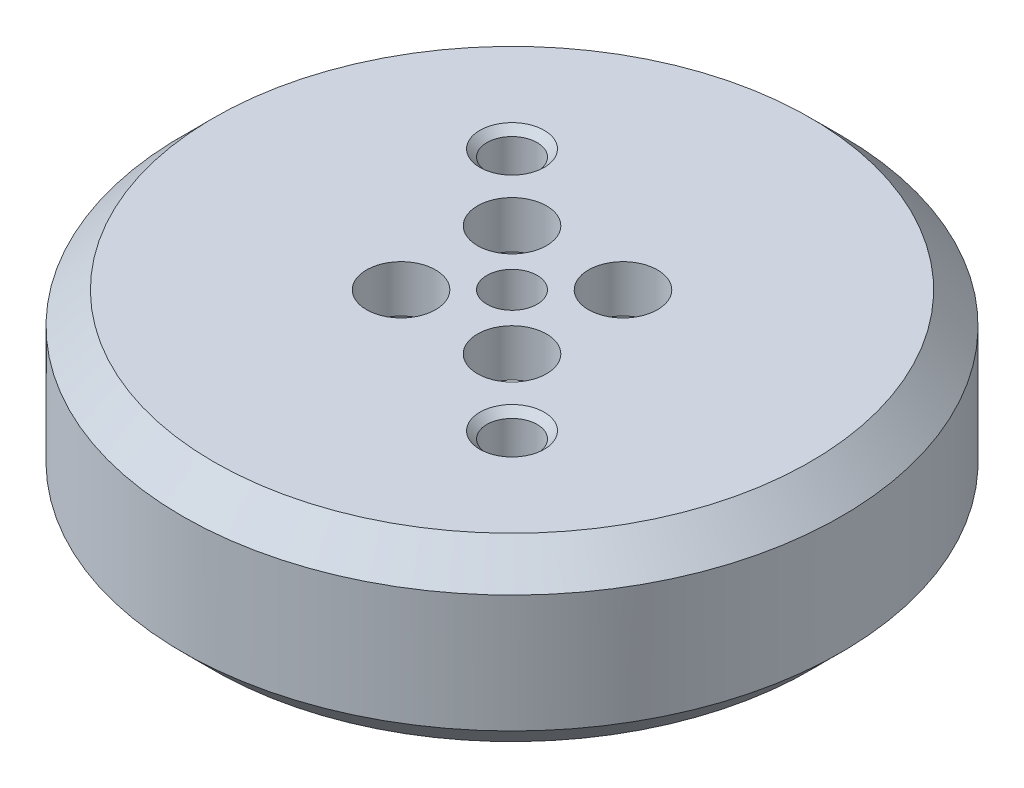
ISO-10303-21;
HEADER;
FILE_DESCRIPTION(('STEP AP214'),'2;1');
FILE_NAME('part.step','',(''),(''),'','','');
FILE_SCHEMA(('AUTOMOTIVE_DESIGN { 1 0 10303 214 1 1 1 1 }'));
ENDSEC;
DATA;
#1=APPLICATION_CONTEXT('core data for automotive mechanical design processes');
#2=APPLICATION_PROTOCOL_DEFINITION('international standard','automotive_design',2000,#1);
#3=PRODUCT_CONTEXT('',#1,'mechanical');
#4=PRODUCT('Part','Part','',(#3));
#5=PRODUCT_RELATED_PRODUCT_CATEGORY('part','',(#4));
#6=PRODUCT_DEFINITION_FORMATION('','',#4);
#7=PRODUCT_DEFINITION_CONTEXT('part definition',#1,'design');
#8=PRODUCT_DEFINITION('design','',#6,#7);
#9=PRODUCT_DEFINITION_SHAPE('','',#8);
#10=(LENGTH_UNIT() NAMED_UNIT(*) SI_UNIT(.MILLI.,.METRE.));
#11=(NAMED_UNIT(*) PLANE_ANGLE_UNIT() SI_UNIT($,.RADIAN.));
#12=(NAMED_UNIT(*) SI_UNIT($,.STERADIAN.) SOLID_ANGLE_UNIT());
#13=UNCERTAINTY_MEASURE_WITH_UNIT(LENGTH_MEASURE(1.E-05),#10,'distance_accuracy_value','');
#14=(GEOMETRIC_REPRESENTATION_CONTEXT(3) GLOBAL_UNCERTAINTY_ASSIGNED_CONTEXT((#13)) GLOBAL_UNIT_ASSIGNED_CONTEXT((#10,
#11,#12)) REPRESENTATION_CONTEXT('',''));
#15=CARTESIAN_POINT('',(0.,0.,0.));
#16=DIRECTION('',(0.,0.,1.));
#17=DIRECTION('',(1.,0.,0.));
#18=AXIS2_PLACEMENT_3D('',#15,#16,#17);
#19=CARTESIAN_POINT('',(0.,-1.,0.));
#20=DIRECTION('',(0.,1.,0.));
#21=DIRECTION('',(0.,0.,1.));
#22=AXIS2_PLACEMENT_3D('',#19,#20,#21);
#23=TOROIDAL_SURFACE('',#22,4.7357470513792,1.);
#24=CARTESIAN_POINT('',(0.,-0.130543442607231,0.));
#25=DIRECTION('',(0.,1.,0.));
#26=DIRECTION('',(0.,0.,1.));
#27=AXIS2_PLACEMENT_3D('',#24,#25,#26);
#28=CIRCLE('',#27,5.22975645898873);
#29=CARTESIAN_POINT('',(-4.17945635745006,-0.130543442607231,-3.14364393284364));
#30=VERTEX_POINT('',#29);
#31=CARTESIAN_POINT('',(3.14364393284364,-0.130543442607231,4.17945635745005));
#32=VERTEX_POINT('',#31);
#33=EDGE_CURVE('E64',#30,#32,#28,.T.);
#34=ORIENTED_EDGE('',*,*,#33,.F.);
#35=CARTESIAN_POINT('',(-4.4822891057726,-0.492217787000647,-3.35232700225438));
#36=CARTESIAN_POINT('',(-4.4732032933485,-0.469683389474045,-3.34229177425603));
#37=CARTESIAN_POINT('',(-4.4633088491144,-0.447666005418995,-3.33186407787081));
#38=CARTESIAN_POINT('',(-4.44175096029905,-0.404737713196822,-3.31047174151622));
#39=CARTESIAN_POINT('',(-4.43008472820176,-0.383828619866387,-3.2995062742211));
#40=CARTESIAN_POINT('',(-4.39219435143152,-0.32289360954591,-3.26618056046404));
#41=CARTESIAN_POINT('',(-4.36311533631435,-0.284755035080705,-3.24343514928884));
#42=CARTESIAN_POINT('',(-4.30835426216737,-0.226975612269722,-3.2072572860547));
#43=CARTESIAN_POINT('',(-4.28493872187265,-0.205481908552504,-3.1933104811285));
#44=CARTESIAN_POINT('',(-4.23478246875228,-0.165672465877191,-3.16708110387943));
#45=CARTESIAN_POINT('',(-4.20804913119097,-0.147349887507297,-3.15479496274247));
#46=CARTESIAN_POINT('',(-4.14851652378555,-0.112357206995817,-3.13157741402367));
#47=CARTESIAN_POINT('',(-4.11537420971447,-0.0960746692484054,-3.1209323233269));
#48=CARTESIAN_POINT('',(-4.04623946115202,-0.0678606454895076,-3.10386708227344));
#49=CARTESIAN_POINT('',(-4.0102453081066,-0.0559318077202538,-3.09744950149712));
#50=CARTESIAN_POINT('',(-3.93668546436377,-0.0361727734389251,-3.08964955784175));
#51=CARTESIAN_POINT('',(-3.89912193458156,-0.0283371295178925,-3.08826048810739));
#52=CARTESIAN_POINT('',(-3.82363760943959,-0.016054724799252,-3.09087402616194));
#53=CARTESIAN_POINT('',(-3.78571669316118,-0.0116091559657878,-3.09487852898513));
#54=CARTESIAN_POINT('',(-3.70997153088221,-0.00512383914183723,-3.10843036971446));
#55=CARTESIAN_POINT('',(-3.67216143060171,-0.00312904524171535,-3.1180766207455));
#56=CARTESIAN_POINT('',(-3.59830505529575,-0.000668933592980089,-3.14278703539813));
#57=CARTESIAN_POINT('',(-3.56225945191618,-0.000204193859236021,-3.15785324415585));
#58=CARTESIAN_POINT('',(-3.48885772855063,0.000110632603870748,-3.19504727315009));
#59=CARTESIAN_POINT('',(-3.45180423574449,-0.000113658599104512,-3.21777549805206));
#60=CARTESIAN_POINT('',(-3.38186190082103,-0.000495964025155716,-3.26892560481961));
#61=CARTESIAN_POINT('',(-3.34897352244858,-0.000653970872636316,-3.2973481197808));
#62=CARTESIAN_POINT('',(-3.28708568153624,-0.000621253769456142,-3.36030203693119));
#63=CARTESIAN_POINT('',(-3.25827804337292,-0.000417244928063869,-3.39502239091414));
#64=CARTESIAN_POINT('',(-3.20688702210451,-2.90392142725851E-05,-3.46881857526934));
#65=CARTESIAN_POINT('',(-3.1843062719738,0.000155149257279583,-3.50789623830622));
#66=CARTESIAN_POINT('',(-3.14600308994325,-0.000529293378231463,-3.58933322176691));
#67=CARTESIAN_POINT('',(-3.13028817114545,-0.0013990739099978,-3.63169607772364));
#68=CARTESIAN_POINT('',(-3.10622775196013,-0.00565873200724966,-3.71835639637355));
#69=CARTESIAN_POINT('',(-3.0978789050754,-0.00904746389148019,-3.7626529709451));
#70=CARTESIAN_POINT('',(-3.08892706703653,-0.0196837649293965,-3.84953978442364));
#71=CARTESIAN_POINT('',(-3.0879919952599,-0.0267505720647958,-3.89211696961916));
#72=CARTESIAN_POINT('',(-3.09269898508368,-0.0457799969006157,-3.97575785714735));
#73=CARTESIAN_POINT('',(-3.09832898860018,-0.0577336128384132,-4.01682419174216));
#74=CARTESIAN_POINT('',(-3.11138678701624,-0.0804761972041075,-4.07798183790519));
#75=CARTESIAN_POINT('',(-3.11687766441774,-0.0893856366781243,-4.09922421370531));
#76=CARTESIAN_POINT('',(-3.12930639618922,-0.108842690523334,-4.14047503795177));
#77=CARTESIAN_POINT('',(-3.13624288849508,-0.119388760483208,-4.16048462510626));
#78=CARTESIAN_POINT('',(-3.15663261958799,-0.150119688489676,-4.2127521306537));
#79=CARTESIAN_POINT('',(-3.17122779354853,-0.17185060183679,-4.24367659738067));
#80=CARTESIAN_POINT('',(-3.20188511870032,-0.218666069965117,-4.29987541402735));
#81=CARTESIAN_POINT('',(-3.21787953732058,-0.243609549463401,-4.32530752920999));
#82=CARTESIAN_POINT('',(-3.25055912062715,-0.29687316683349,-4.37188381103974));
#83=CARTESIAN_POINT('',(-3.2672446828199,-0.32519526600361,-4.39302546764101));
#84=CARTESIAN_POINT('',(-3.28367680610697,-0.354934598960436,-4.41203866911296));
#85=B_SPLINE_CURVE_WITH_KNOTS('',3,(#35,#36,#37,#38,#39,#40,#41,#42,#43,#44,#45,#46,#47,#48,#49,
#50,#51,#52,#53,#54,#55,#56,#57,#58,#59,#60,#61,#62,#63,#64,#65,#66,#67,#68,#69,#70,#71,#72,#73,
#74,#75,#76,#77,#78,#79,#80,#81,#82,#83,#84),.UNSPECIFIED.,.F.,.F.,(4,2,2,2,2,2,2,2,2,2,2,2,2,2,
2,2,2,2,2,2,2,2,2,2,4),(0.,0.0788118781241599,0.157749058953661,0.315952742502714,
0.419791761297973,0.523403953298577,0.638120750650584,0.752907211400801,0.867540517388498,
0.982214110351037,1.09896116511249,1.21575231883238,1.34557647571674,1.47541507457041,
1.61011732351179,1.74487644285548,1.87978265852036,2.01462755302311,2.14339626153474,
2.27192883239819,2.34284983655605,2.41370431833988,2.53461425187403,2.6513650202477,
2.76818389563031),.UNSPECIFIED.);
#86=CARTESIAN_POINT('',(-3.5001997515439,0.,-3.18996893933763));
#87=VERTEX_POINT('',#86);
#88=EDGE_CURVE('E11',#30,#87,#85,.T.);
#89=ORIENTED_EDGE('',*,*,#88,.T.);
#90=CARTESIAN_POINT('',(0.,0.,0.));
#91=DIRECTION('',(0.,1.,0.));
#92=DIRECTION('',(0.,0.,1.));
#93=AXIS2_PLACEMENT_3D('',#90,#91,#92);
#94=CIRCLE('',#93,4.7357470513792);
#95=CARTESIAN_POINT('',(3.1899689393376,0.,3.50019975154391));
#96=VERTEX_POINT('',#95);
#97=EDGE_CURVE('E97',#96,#87,#94,.F.);
#98=ORIENTED_EDGE('',*,*,#97,.F.);
#99=CARTESIAN_POINT('',(4.41203866911296,-0.354934598960436,3.28367680610697));
#100=CARTESIAN_POINT('',(4.40119079303016,-0.338003324329135,3.27430965832733));
#101=CARTESIAN_POINT('',(4.38968443998195,-0.321540351104938,3.26487744493115));
#102=CARTESIAN_POINT('',(4.36527885876277,-0.289609558951426,3.24606242962476));
#103=CARTESIAN_POINT('',(4.35237774590796,-0.274143132786103,3.23667971300334));
#104=CARTESIAN_POINT('',(4.31168170922958,-0.229576869631255,3.2090281313032));
#105=CARTESIAN_POINT('',(4.28176271092001,-0.202100955115304,3.19113650877033));
#106=CARTESIAN_POINT('',(4.22722200016678,-0.160536309374386,3.16364188577563));
#107=CARTESIAN_POINT('',(4.20407330444193,-0.145009877696819,3.15324308089717));
#108=CARTESIAN_POINT('',(4.14853085943253,-0.112369571762166,3.1315847057551));
#109=CARTESIAN_POINT('',(4.11539420846956,-0.0960856695019954,3.12093928713428));
#110=CARTESIAN_POINT('',(4.04625798970031,-0.0678653657801922,3.10386962829535));
#111=CARTESIAN_POINT('',(4.01025513724642,-0.055934042321664,3.09745031154623));
#112=CARTESIAN_POINT('',(3.93668369523314,-0.0361727032203777,3.08964960207797));
#113=CARTESIAN_POINT('',(3.89911762382493,-0.028336347678105,3.08826040175425));
#114=CARTESIAN_POINT('',(3.82363304743932,-0.0160540635743174,3.09087442015151));
#115=CARTESIAN_POINT('',(3.78571446195885,-0.0116089297199798,3.09487890223356));
#116=CARTESIAN_POINT('',(3.70997202106085,-0.00512391695914288,3.1084303084292));
#117=CARTESIAN_POINT('',(3.67216234518571,-0.00312910357104622,3.11807639475079));
#118=CARTESIAN_POINT('',(3.59830591036727,-0.000668934150455832,3.14278666921297));
#119=CARTESIAN_POINT('',(3.56225986556696,-0.000204192718868674,3.15785303188104));
#120=CARTESIAN_POINT('',(3.48885760244742,0.000110629904972801,3.1950473400171));
#121=CARTESIAN_POINT('',(3.45180399044153,-0.000113660767279083,3.21777564952229));
#122=CARTESIAN_POINT('',(3.38186168184274,-0.000495964421638807,3.26892579290304));
#123=CARTESIAN_POINT('',(3.34897342141136,-0.000653970466962142,3.29734822221704));
#124=CARTESIAN_POINT('',(3.28708582254157,-0.000621254209454442,3.36030189385115));
#125=CARTESIAN_POINT('',(3.25827830097738,-0.000417247538306542,3.39502208056447));
#126=CARTESIAN_POINT('',(3.20688722403147,-2.90400988483737E-05,3.46881822570623));
#127=CARTESIAN_POINT('',(3.18430635720395,0.000155152093067724,3.50789605548887));
#128=CARTESIAN_POINT('',(3.14600285936995,-0.000529298812610942,3.58933371360231));
#129=CARTESIAN_POINT('',(3.13028779379368,-0.00139909934439446,3.63169710209354));
#130=CARTESIAN_POINT('',(3.10622754771324,-0.00565880932951816,3.71835746609766));
#131=CARTESIAN_POINT('',(3.0978788435366,-0.00904751244402116,3.76265350648002));
#132=CARTESIAN_POINT('',(3.0889271116543,-0.019683735375029,3.84953941034191));
#133=CARTESIAN_POINT('',(3.08799203272152,-0.0267505070247965,3.89211622110295));
#134=CARTESIAN_POINT('',(3.09269886465079,-0.0457797256810034,3.97575712567791));
#135=CARTESIAN_POINT('',(3.09832883327955,-0.0577332577101406,4.01682382648426));
#136=CARTESIAN_POINT('',(3.11138640808968,-0.08047558391318,4.07797986332596));
#137=CARTESIAN_POINT('',(3.11687679479006,-0.0893843790908939,4.09922036508916));
#138=CARTESIAN_POINT('',(3.12930499272172,-0.108840389757455,4.14047134169542));
#139=CARTESIAN_POINT('',(3.13624170723849,-0.11938636227637,4.16048273374253));
#140=CARTESIAN_POINT('',(3.15823068225882,-0.152529436537361,4.21684646075603));
#141=CARTESIAN_POINT('',(3.1748860108807,-0.177300125381267,4.25133010625357));
#142=CARTESIAN_POINT('',(3.2106052137196,-0.232171583299498,4.31452027176408));
#143=CARTESIAN_POINT('',(3.22968086535954,-0.262298726045911,4.34319663116251));
#144=CARTESIAN_POINT('',(3.26673693376974,-0.32438189930894,4.3926342772274));
#145=CARTESIAN_POINT('',(3.28468583728596,-0.356008917458807,4.41384007881145));
#146=CARTESIAN_POINT('',(3.31954283099532,-0.422099081276888,4.45146425351929));
#147=CARTESIAN_POINT('',(3.33645844044146,-0.456535976094213,4.46792160216791));
#148=CARTESIAN_POINT('',(3.35232700225438,-0.492217787000646,4.4822891057726));
#149=B_SPLINE_CURVE_WITH_KNOTS('',3,(#99,#100,#101,#102,#103,#104,#105,#106,#107,#108,#109,#110,
#111,#112,#113,#114,#115,#116,#117,#118,#119,#120,#121,#122,#123,#124,#125,#126,#127,#128,#129,
#130,#131,#132,#133,#134,#135,#136,#137,#138,#139,#140,#141,#142,#143,#144,#145,#146,#147,#148),
.UNSPECIFIED.,.F.,.F.,(4,2,2,2,2,2,2,2,2,2,2,2,2,2,2,2,2,2,2,2,2,2,2,2,4),(0.,
0.0665144523016777,0.133119933698804,0.265516964643031,0.354564355412378,0.469249295750469,
0.584067610348027,0.698707630619997,0.813374507669311,0.930120167616292,1.04691271636456,
1.1767373027593,1.30657547210228,1.44127712077751,1.57603684038098,1.71094467956316,
1.84578795102548,1.9745555262643,2.10308923013347,2.1740037624755,2.24486471638024,
2.38079545444645,2.51741501057681,2.64331422954016,2.7681485795329),.UNSPECIFIED.);
#150=EDGE_CURVE('E120',#96,#32,#149,.T.);
#151=ORIENTED_EDGE('',*,*,#150,.T.);
#152=EDGE_LOOP('',(#34,#89,#98,#151));
#153=FACE_BOUND('',#152,.T.);
#154=ADVANCED_FACE('F37',(#153),#23,.F.);
#155=CARTESIAN_POINT('',(0.,0.,0.));
#156=DIRECTION('',(0.,1.,0.));
#157=DIRECTION('',(0.,0.,1.));
#158=AXIS2_PLACEMENT_3D('',#155,#156,#157);
#159=PLANE('',#158);
#160=ORIENTED_EDGE('',*,*,#97,.T.);
#161=CARTESIAN_POINT('',(-3.88908729652601,0.,-3.88908729652601));
#162=DIRECTION('',(0.,1.,0.));
#163=DIRECTION('',(0.,0.,1.));
#164=AXIS2_PLACEMENT_3D('',#161,#162,#163);
#165=CIRCLE('',#164,0.799999999999999);
#166=CARTESIAN_POINT('',(-3.1899689393376,0.,-3.50019975154391));
#167=VERTEX_POINT('',#166);
#168=EDGE_CURVE('E83',#87,#167,#165,.T.);
#169=ORIENTED_EDGE('',*,*,#168,.T.);
#170=CARTESIAN_POINT('',(3.5001997515439,0.,3.18996893933762));
#171=VERTEX_POINT('',#170);
#172=EDGE_CURVE('E94',#167,#171,#94,.F.);
#173=ORIENTED_EDGE('',*,*,#172,.T.);
#174=CARTESIAN_POINT('',(3.88908729652601,0.,3.88908729652601));
#175=DIRECTION('',(0.,1.,0.));
#176=DIRECTION('',(0.,0.,1.));
#177=AXIS2_PLACEMENT_3D('',#174,#175,#176);
#178=CIRCLE('',#177,0.799999999999999);
#179=EDGE_CURVE('E146',#171,#96,#178,.T.);
#180=ORIENTED_EDGE('',*,*,#179,.T.);
#181=EDGE_LOOP('',(#160,#169,#173,#180));
#182=FACE_BOUND('',#181,.T.);
#183=CARTESIAN_POINT('',(0.,0.,0.));
#184=DIRECTION('',(0.,1.,0.));
#185=DIRECTION('',(0.,0.,1.));
#186=AXIS2_PLACEMENT_3D('',#183,#184,#185);
#187=CIRCLE('',#186,0.8);
#188=CARTESIAN_POINT('',(0.,0.,0.8));
#189=VERTEX_POINT('',#188);
#190=EDGE_CURVE('E266',#189,#189,#187,.T.);
#191=ORIENTED_EDGE('',*,*,#190,.T.);
#192=EDGE_LOOP('',(#191));
#193=FACE_BOUND('',#192,.T.);
#194=CARTESIAN_POINT('',(-1.76776695296637,0.,1.76776695296637));
#195=DIRECTION('',(0.,1.,0.));
#196=DIRECTION('',(0.,0.,1.));
#197=AXIS2_PLACEMENT_3D('',#194,#195,#196);
#198=CIRCLE('',#197,1.1);
#199=CARTESIAN_POINT('',(-1.76776695296637,0.,2.86776695296637));
#200=VERTEX_POINT('',#199);
#201=EDGE_CURVE('E263',#200,#200,#198,.T.);
#202=ORIENTED_EDGE('',*,*,#201,.T.);
#203=EDGE_LOOP('',(#202));
#204=FACE_BOUND('',#203,.T.);
#205=CARTESIAN_POINT('',(1.76776695296637,0.,1.76776695296637));
#206=DIRECTION('',(0.,1.,0.));
#207=DIRECTION('',(0.,0.,1.));
#208=AXIS2_PLACEMENT_3D('',#205,#206,#207);
#209=CIRCLE('',#208,1.1);
#210=CARTESIAN_POINT('',(1.76776695296637,0.,2.86776695296637));
#211=VERTEX_POINT('',#210);
#212=EDGE_CURVE('E238',#211,#211,#209,.T.);
#213=ORIENTED_EDGE('',*,*,#212,.T.);
#214=EDGE_LOOP('',(#213));
#215=FACE_BOUND('',#214,.T.);
#216=CARTESIAN_POINT('',(1.76776695296637,0.,-1.76776695296637));
#217=DIRECTION('',(0.,1.,0.));
#218=DIRECTION('',(0.,0.,1.));
#219=AXIS2_PLACEMENT_3D('',#216,#217,#218);
#220=CIRCLE('',#219,1.1);
#221=CARTESIAN_POINT('',(1.76776695296637,0.,-0.667766952966369));
#222=VERTEX_POINT('',#221);
#223=EDGE_CURVE('E233',#222,#222,#220,.T.);
#224=ORIENTED_EDGE('',*,*,#223,.T.);
#225=EDGE_LOOP('',(#224));
#226=FACE_BOUND('',#225,.T.);
#227=CARTESIAN_POINT('',(-1.76776695296637,0.,-1.76776695296637));
#228=DIRECTION('',(0.,1.,0.));
#229=DIRECTION('',(0.,0.,1.));
#230=AXIS2_PLACEMENT_3D('',#227,#228,#229);
#231=CIRCLE('',#230,1.1);
#232=CARTESIAN_POINT('',(-1.76776695296637,0.,-0.667766952966369));
#233=VERTEX_POINT('',#232);
#234=EDGE_CURVE('E240',#233,#233,#231,.T.);
#235=ORIENTED_EDGE('',*,*,#234,.T.);
#236=EDGE_LOOP('',(#235));
#237=FACE_BOUND('',#236,.T.);
#238=ADVANCED_FACE('F91',(#182,#193,#204,#215,#226,#237),#159,.F.);
#239=CARTESIAN_POINT('',(0.,1.5,0.));
#240=DIRECTION('',(0.,-1.,0.));
#241=DIRECTION('',(0.,0.,-1.));
#242=AXIS2_PLACEMENT_3D('',#239,#240,#241);
#243=CYLINDRICAL_SURFACE('',#242,10.5);
#244=CARTESIAN_POINT('',(0.,-3.25,0.));
#245=DIRECTION('',(0.,-1.,0.));
#246=DIRECTION('',(0.,0.,-1.));
#247=AXIS2_PLACEMENT_3D('',#244,#245,#246);
#248=CIRCLE('',#247,10.5);
#249=CARTESIAN_POINT('',(0.,-3.25,-10.5));
#250=VERTEX_POINT('',#249);
#251=EDGE_CURVE('E118',#250,#250,#248,.F.);
#252=ORIENTED_EDGE('',*,*,#251,.T.);
#253=EDGE_LOOP('',(#252));
#254=FACE_BOUND('',#253,.T.);
#255=CARTESIAN_POINT('',(0.,0.499999999999994,0.));
#256=DIRECTION('',(0.,1.,0.));
#257=DIRECTION('',(0.,0.,1.));
#258=AXIS2_PLACEMENT_3D('',#255,#256,#257);
#259=CIRCLE('',#258,10.5);
#260=CARTESIAN_POINT('',(0.,0.499999999999994,10.5));
#261=VERTEX_POINT('',#260);
#262=EDGE_CURVE('E112',#261,#261,#259,.F.);
#263=ORIENTED_EDGE('',*,*,#262,.T.);
#264=EDGE_LOOP('',(#263));
#265=FACE_BOUND('',#264,.T.);
#266=ADVANCED_FACE('F183',(#254,#265),#243,.T.);
#267=CARTESIAN_POINT('',(0.,1.5,0.));
#268=DIRECTION('',(0.,1.,0.));
#269=DIRECTION('',(0.,0.,1.));
#270=AXIS2_PLACEMENT_3D('',#267,#268,#269);
#271=PLANE('',#270);
#272=CARTESIAN_POINT('',(-3.88908729652601,1.5,-3.88908729652601));
#273=DIRECTION('',(0.,1.,0.));
#274=DIRECTION('',(0.,0.,1.));
#275=AXIS2_PLACEMENT_3D('',#272,#273,#274);
#276=CIRCLE('',#275,1.025);
#277=CARTESIAN_POINT('',(-3.88908729652601,1.5,-2.86408729652601));
#278=VERTEX_POINT('',#277);
#279=EDGE_CURVE('E436',#278,#278,#276,.T.);
#280=ORIENTED_EDGE('',*,*,#279,.F.);
#281=EDGE_LOOP('',(#280));
#282=FACE_BOUND('',#281,.T.);
#283=CARTESIAN_POINT('',(3.88908729652601,1.5,3.88908729652601));
#284=DIRECTION('',(0.,1.,0.));
#285=DIRECTION('',(0.,0.,1.));
#286=AXIS2_PLACEMENT_3D('',#283,#284,#285);
#287=CIRCLE('',#286,1.025);
#288=CARTESIAN_POINT('',(3.88908729652601,1.5,4.91408729652601));
#289=VERTEX_POINT('',#288);
#290=EDGE_CURVE('E98',#289,#289,#287,.T.);
#291=ORIENTED_EDGE('',*,*,#290,.F.);
#292=EDGE_LOOP('',(#291));
#293=FACE_BOUND('',#292,.T.);
#294=CARTESIAN_POINT('',(0.,1.5,0.));
#295=DIRECTION('',(0.,1.,0.));
#296=DIRECTION('',(0.,0.,1.));
#297=AXIS2_PLACEMENT_3D('',#294,#295,#296);
#298=CIRCLE('',#297,9.5);
#299=CARTESIAN_POINT('',(0.,1.5,9.5));
#300=VERTEX_POINT('',#299);
#301=EDGE_CURVE('E104',#300,#300,#298,.T.);
#302=ORIENTED_EDGE('',*,*,#301,.T.);
#303=EDGE_LOOP('',(#302));
#304=FACE_BOUND('',#303,.T.);
#305=CARTESIAN_POINT('',(-1.76776695296637,1.5,-1.76776695296637));
#306=DIRECTION('',(0.,1.,0.));
#307=DIRECTION('',(0.,0.,1.));
#308=AXIS2_PLACEMENT_3D('',#305,#306,#307);
#309=CIRCLE('',#308,1.1);
#310=CARTESIAN_POINT('',(-1.76776695296637,1.5,-0.667766952966369));
#311=VERTEX_POINT('',#310);
#312=EDGE_CURVE('E247',#311,#311,#309,.T.);
#313=ORIENTED_EDGE('',*,*,#312,.F.);
#314=EDGE_LOOP('',(#313));
#315=FACE_BOUND('',#314,.T.);
#316=CARTESIAN_POINT('',(1.76776695296637,1.5,-1.76776695296637));
#317=DIRECTION('',(0.,1.,0.));
#318=DIRECTION('',(0.,0.,1.));
#319=AXIS2_PLACEMENT_3D('',#316,#317,#318);
#320=CIRCLE('',#319,1.1);
#321=CARTESIAN_POINT('',(1.76776695296637,1.5,-0.667766952966369));
#322=VERTEX_POINT('',#321);
#323=EDGE_CURVE('E230',#322,#322,#320,.T.);
#324=ORIENTED_EDGE('',*,*,#323,.F.);
#325=EDGE_LOOP('',(#324));
#326=FACE_BOUND('',#325,.T.);
#327=CARTESIAN_POINT('',(1.76776695296637,1.5,1.76776695296637));
#328=DIRECTION('',(0.,1.,0.));
#329=DIRECTION('',(0.,0.,1.));
#330=AXIS2_PLACEMENT_3D('',#327,#328,#329);
#331=CIRCLE('',#330,1.1);
#332=CARTESIAN_POINT('',(1.76776695296637,1.5,2.86776695296637));
#333=VERTEX_POINT('',#332);
#334=EDGE_CURVE('E235',#333,#333,#331,.T.);
#335=ORIENTED_EDGE('',*,*,#334,.F.);
#336=EDGE_LOOP('',(#335));
#337=FACE_BOUND('',#336,.T.);
#338=CARTESIAN_POINT('',(-1.76776695296637,1.5,1.76776695296637));
#339=DIRECTION('',(0.,1.,0.));
#340=DIRECTION('',(0.,0.,1.));
#341=AXIS2_PLACEMENT_3D('',#338,#339,#340);
#342=CIRCLE('',#341,1.1);
#343=CARTESIAN_POINT('',(-1.76776695296637,1.5,2.86776695296637));
#344=VERTEX_POINT('',#343);
#345=EDGE_CURVE('E260',#344,#344,#342,.T.);
#346=ORIENTED_EDGE('',*,*,#345,.F.);
#347=EDGE_LOOP('',(#346));
#348=FACE_BOUND('',#347,.T.);
#349=CARTESIAN_POINT('',(0.,1.5,0.));
#350=DIRECTION('',(0.,1.,0.));
#351=DIRECTION('',(0.,0.,1.));
#352=AXIS2_PLACEMENT_3D('',#349,#350,#351);
#353=CIRCLE('',#352,0.8);
#354=CARTESIAN_POINT('',(0.,1.5,0.8));
#355=VERTEX_POINT('',#354);
#356=EDGE_CURVE('E250',#355,#355,#353,.T.);
#357=ORIENTED_EDGE('',*,*,#356,.F.);
#358=EDGE_LOOP('',(#357));
#359=FACE_BOUND('',#358,.T.);
#360=ADVANCED_FACE('F203',(#282,#293,#304,#315,#326,#337,#348,#359),#271,.T.);
#361=CARTESIAN_POINT('',(0.,0.,0.));
#362=DIRECTION('',(0.,1.,0.));
#363=DIRECTION('',(0.,0.,1.));
#364=AXIS2_PLACEMENT_3D('',#361,#362,#363);
#365=CYLINDRICAL_SURFACE('',#364,0.8);
#366=ORIENTED_EDGE('',*,*,#356,.T.);
#367=EDGE_LOOP('',(#366));
#368=FACE_BOUND('',#367,.T.);
#369=ORIENTED_EDGE('',*,*,#190,.F.);
#370=EDGE_LOOP('',(#369));
#371=FACE_BOUND('',#370,.T.);
#372=ADVANCED_FACE('F208',(#368,#371),#365,.F.);
#373=CARTESIAN_POINT('',(-1.76776695296637,1.5,1.76776695296637));
#374=DIRECTION('',(0.,1.,0.));
#375=DIRECTION('',(0.,0.,1.));
#376=AXIS2_PLACEMENT_3D('',#373,#374,#375);
#377=CYLINDRICAL_SURFACE('',#376,1.1);
#378=ORIENTED_EDGE('',*,*,#345,.T.);
#379=EDGE_LOOP('',(#378));
#380=FACE_BOUND('',#379,.T.);
#381=ORIENTED_EDGE('',*,*,#201,.F.);
#382=EDGE_LOOP('',(#381));
#383=FACE_BOUND('',#382,.T.);
#384=ADVANCED_FACE('F212',(#380,#383),#377,.F.);
#385=CARTESIAN_POINT('',(1.76776695296637,1.5,1.76776695296637));
#386=DIRECTION('',(0.,1.,0.));
#387=DIRECTION('',(0.,0.,1.));
#388=AXIS2_PLACEMENT_3D('',#385,#386,#387);
#389=CYLINDRICAL_SURFACE('',#388,1.1);
#390=ORIENTED_EDGE('',*,*,#334,.T.);
#391=EDGE_LOOP('',(#390));
#392=FACE_BOUND('',#391,.T.);
#393=ORIENTED_EDGE('',*,*,#212,.F.);
#394=EDGE_LOOP('',(#393));
#395=FACE_BOUND('',#394,.T.);
#396=ADVANCED_FACE('F216',(#392,#395),#389,.F.);
#397=CARTESIAN_POINT('',(1.76776695296637,1.5,-1.76776695296637));
#398=DIRECTION('',(0.,1.,0.));
#399=DIRECTION('',(0.,0.,1.));
#400=AXIS2_PLACEMENT_3D('',#397,#398,#399);
#401=CYLINDRICAL_SURFACE('',#400,1.1);
#402=ORIENTED_EDGE('',*,*,#323,.T.);
#403=EDGE_LOOP('',(#402));
#404=FACE_BOUND('',#403,.T.);
#405=ORIENTED_EDGE('',*,*,#223,.F.);
#406=EDGE_LOOP('',(#405));
#407=FACE_BOUND('',#406,.T.);
#408=ADVANCED_FACE('F219',(#404,#407),#401,.F.);
#409=CARTESIAN_POINT('',(-1.76776695296637,1.5,-1.76776695296637));
#410=DIRECTION('',(0.,1.,0.));
#411=DIRECTION('',(0.,0.,1.));
#412=AXIS2_PLACEMENT_3D('',#409,#410,#411);
#413=CYLINDRICAL_SURFACE('',#412,1.1);
#414=ORIENTED_EDGE('',*,*,#312,.T.);
#415=EDGE_LOOP('',(#414));
#416=FACE_BOUND('',#415,.T.);
#417=ORIENTED_EDGE('',*,*,#234,.F.);
#418=EDGE_LOOP('',(#417));
#419=FACE_BOUND('',#418,.T.);
#420=ADVANCED_FACE('F155',(#416,#419),#413,.F.);
#421=CARTESIAN_POINT('',(0.,-1.25,0.));
#422=DIRECTION('',(0.,-1.,0.));
#423=DIRECTION('',(0.,0.,-1.));
#424=AXIS2_PLACEMENT_3D('',#421,#422,#423);
#425=CONICAL_SURFACE('',#424,7.2,1.05410118803262);
#426=CARTESIAN_POINT('',(-4.17911565315128,-0.130343442607233,-3.14351130955134));
#427=CARTESIAN_POINT('',(-4.23501404820645,-0.163179445778835,-3.16524584085409));
#428=CARTESIAN_POINT('',(-4.28804937627686,-0.196793427932169,-3.19311963177172));
#429=CARTESIAN_POINT('',(-4.38659964289425,-0.264312783131352,-3.25978759256715));
#430=CARTESIAN_POINT('',(-4.43210971497415,-0.298218329935834,-3.29858878553154));
#431=CARTESIAN_POINT('',(-4.50824110949197,-0.360512428132253,-3.3798537861899));
#432=CARTESIAN_POINT('',(-4.54004218701845,-0.389028961918872,-3.42112033819771));
#433=CARTESIAN_POINT('',(-4.59537265109569,-0.444515768246142,-3.50976509153978));
#434=CARTESIAN_POINT('',(-4.61890967860844,-0.471487449744447,-3.55713759158802));
#435=CARTESIAN_POINT('',(-4.65575205245369,-0.522107604433815,-3.65488322894955));
#436=CARTESIAN_POINT('',(-4.66940456113022,-0.545842238885464,-3.70507986660858));
#437=CARTESIAN_POINT('',(-4.68673558022619,-0.590304368855997,-3.80847285641223));
#438=CARTESIAN_POINT('',(-4.69041929064071,-0.611033426822031,-3.86166762985915));
#439=CARTESIAN_POINT('',(-4.68708042430245,-0.646599327377149,-3.96332320976989));
#440=CARTESIAN_POINT('',(-4.68116109074422,-0.661829287303647,-4.01168162746939));
#441=CARTESIAN_POINT('',(-4.66026021910397,-0.688567027027853,-4.10746175516264));
#442=CARTESIAN_POINT('',(-4.64528782969483,-0.700078546545228,-4.15488436095831));
#443=CARTESIAN_POINT('',(-4.60872533284874,-0.717708049001664,-4.24129953121208));
#444=CARTESIAN_POINT('',(-4.58814250702796,-0.724306859135761,-4.28062151989133));
#445=CARTESIAN_POINT('',(-4.54049506072194,-0.733919939317389,-4.35560304729186));
#446=CARTESIAN_POINT('',(-4.5134342162206,-0.736936291466884,-4.39126470235373));
#447=CARTESIAN_POINT('',(-4.45606440370145,-0.739159837851304,-4.45497328123293));
#448=CARTESIAN_POINT('',(-4.42618727436571,-0.738651932648055,-4.48340084545717));
#449=CARTESIAN_POINT('',(-4.36255612060445,-0.734512716631258,-4.53523765148775));
#450=CARTESIAN_POINT('',(-4.32880270733109,-0.73088189760599,-4.55864768271696));
#451=CARTESIAN_POINT('',(-4.25898752232495,-0.720711611144376,-4.59957142268432));
#452=CARTESIAN_POINT('',(-4.22296722544277,-0.714215912020921,-4.61716713989201));
#453=CARTESIAN_POINT('',(-4.1492222405246,-0.698551353552941,-4.64665422510663));
#454=CARTESIAN_POINT('',(-4.11149730955076,-0.689382112163702,-4.65854477721213));
#455=CARTESIAN_POINT('',(-4.03355629586259,-0.668164272154214,-4.67700041214356));
#456=CARTESIAN_POINT('',(-3.99330646846566,-0.656000588892159,-4.6832889006839));
#457=CARTESIAN_POINT('',(-3.91307275902557,-0.629409218652342,-4.68974103780488));
#458=CARTESIAN_POINT('',(-3.87308897297462,-0.61498075626354,-4.68990258404082));
#459=CARTESIAN_POINT('',(-3.79067038382,-0.582815950422462,-4.68417992818487));
#460=CARTESIAN_POINT('',(-3.74834538551711,-0.564897828405124,-4.67774203932365));
#461=CARTESIAN_POINT('',(-3.6660157815283,-0.527254288494397,-4.65852105970492));
#462=CARTESIAN_POINT('',(-3.62601196453804,-0.507528262112508,-4.64573582617192));
#463=CARTESIAN_POINT('',(-3.54480459790631,-0.464424439558905,-4.61268784008623));
#464=CARTESIAN_POINT('',(-3.50396079332239,-0.440884343996812,-4.59175259266091));
#465=CARTESIAN_POINT('',(-3.42687846172703,-0.392631479130236,-4.54363341698359));
#466=CARTESIAN_POINT('',(-3.39064412861159,-0.367917669606834,-4.51644386055441));
#467=CARTESIAN_POINT('',(-3.3201092706685,-0.315333478012534,-4.45363358153706));
#468=CARTESIAN_POINT('',(-3.28636845256939,-0.287395354942195,-4.41744034674067));
#469=CARTESIAN_POINT('',(-3.22615413196469,-0.231475993247674,-4.33957284498192));
#470=CARTESIAN_POINT('',(-3.19966949029196,-0.203494887776155,-4.29790712613159));
#471=CARTESIAN_POINT('',(-3.16470549763879,-0.160561848433886,-4.22970244858687));
#472=CARTESIAN_POINT('',(-3.15346389371804,-0.145364555218766,-4.2047044926022));
#473=CARTESIAN_POINT('',(-3.14351130955124,-0.130343442607219,-4.17911565315134));
#474=B_SPLINE_CURVE_WITH_KNOTS('',3,(#426,#427,#428,#429,#430,#431,#432,#433,#434,#435,#436,
#437,#438,#439,#440,#441,#442,#443,#444,#445,#446,#447,#448,#449,#450,#451,#452,#453,#454,#455,
#456,#457,#458,#459,#460,#461,#462,#463,#464,#465,#466,#467,#468,#469,#470,#471,#472,#473),
.UNSPECIFIED.,.F.,.F.,(4,2,2,2,2,2,2,2,2,2,2,2,2,2,2,2,2,2,2,2,2,2,2,4),(0.,0.204798597635145,
0.409729121745985,0.58705711368476,0.76422071324612,0.934812303830731,1.10531489205524,
1.25757636336141,1.40968422160012,1.543575600328,1.67738912409241,1.80051877881605,
1.92362904695392,2.04492034363143,2.16622898113364,2.2932397082411,2.42029401629023,
2.55895598150188,2.6976647889321,2.85177078598209,3.00601600747257,3.17575254838204,
3.34522704290025,3.43911929948485),.UNSPECIFIED.);
#475=CARTESIAN_POINT('',(-3.14364393284364,-0.130543442607231,-4.17945635745005));
#476=VERTEX_POINT('',#475);
#477=EDGE_CURVE('E57',#30,#476,#474,.T.);
#478=ORIENTED_EDGE('',*,*,#477,.F.);
#479=ORIENTED_EDGE('',*,*,#33,.T.);
#480=CARTESIAN_POINT('',(4.17911565315128,-0.130343442607233,3.14351130955134));
#481=CARTESIAN_POINT('',(4.23501404820646,-0.163179445778835,3.16524584085409));
#482=CARTESIAN_POINT('',(4.28804937627686,-0.196793427932169,3.19311963177172));
#483=CARTESIAN_POINT('',(4.38659964289426,-0.264312783131352,3.25978759256715));
#484=CARTESIAN_POINT('',(4.43210971497415,-0.298218329935835,3.29858878553154));
#485=CARTESIAN_POINT('',(4.50824110949197,-0.360512428132253,3.3798537861899));
#486=CARTESIAN_POINT('',(4.54004218701845,-0.389028961918872,3.42112033819771));
#487=CARTESIAN_POINT('',(4.59537265109569,-0.444515768246142,3.50976509153978));
#488=CARTESIAN_POINT('',(4.61890967860844,-0.471487449744447,3.55713759158801));
#489=CARTESIAN_POINT('',(4.65575205245369,-0.522107604433816,3.65488322894955));
#490=CARTESIAN_POINT('',(4.66940456113022,-0.545842238885465,3.70507986660858));
#491=CARTESIAN_POINT('',(4.6867355802262,-0.590304368855997,3.80847285641222));
#492=CARTESIAN_POINT('',(4.69041929064071,-0.611033426822031,3.86166762985915));
#493=CARTESIAN_POINT('',(4.68708042430246,-0.646599327377149,3.96332320976989));
#494=CARTESIAN_POINT('',(4.68116109074422,-0.661829287303647,4.01168162746939));
#495=CARTESIAN_POINT('',(4.66026021910397,-0.688567027027853,4.10746175516264));
#496=CARTESIAN_POINT('',(4.64528782969483,-0.700078546545228,4.15488436095831));
#497=CARTESIAN_POINT('',(4.60872533284875,-0.717708049001664,4.24129953121207));
#498=CARTESIAN_POINT('',(4.58814250702796,-0.724306859135761,4.28062151989133));
#499=CARTESIAN_POINT('',(4.54049506072194,-0.733919939317389,4.35560304729185));
#500=CARTESIAN_POINT('',(4.51343421622061,-0.736936291466884,4.39126470235373));
#501=CARTESIAN_POINT('',(4.45606440370145,-0.739159837851304,4.45497328123293));
#502=CARTESIAN_POINT('',(4.42618727436572,-0.738651932648055,4.48340084545717));
#503=CARTESIAN_POINT('',(4.36255612060445,-0.734512716631258,4.53523765148775));
#504=CARTESIAN_POINT('',(4.3288027073311,-0.73088189760599,4.55864768271696));
#505=CARTESIAN_POINT('',(4.25898752232495,-0.720711611144376,4.59957142268432));
#506=CARTESIAN_POINT('',(4.22296722544278,-0.714215912020921,4.617167139892));
#507=CARTESIAN_POINT('',(4.14922224052461,-0.698551353552941,4.64665422510663));
#508=CARTESIAN_POINT('',(4.11149730955076,-0.689382112163702,4.65854477721213));
#509=CARTESIAN_POINT('',(4.03355629586259,-0.668164272154215,4.67700041214356));
#510=CARTESIAN_POINT('',(3.99330646846566,-0.65600058889216,4.6832889006839));
#511=CARTESIAN_POINT('',(3.91307275902557,-0.629409218652343,4.68974103780488));
#512=CARTESIAN_POINT('',(3.87308897297462,-0.61498075626354,4.68990258404082));
#513=CARTESIAN_POINT('',(3.79067038382,-0.582815950422461,4.68417992818487));
#514=CARTESIAN_POINT('',(3.74834538551711,-0.564897828405124,4.67774203932365));
#515=CARTESIAN_POINT('',(3.6660157815283,-0.527254288494397,4.65852105970492));
#516=CARTESIAN_POINT('',(3.62601196453804,-0.507528262112508,4.64573582617192));
#517=CARTESIAN_POINT('',(3.54480459790631,-0.464424439558905,4.61268784008623));
#518=CARTESIAN_POINT('',(3.50396079332239,-0.440884343996812,4.59175259266091));
#519=CARTESIAN_POINT('',(3.42687846172703,-0.392631479130236,4.54363341698359));
#520=CARTESIAN_POINT('',(3.39064412861159,-0.367917669606834,4.51644386055441));
#521=CARTESIAN_POINT('',(3.3201092706685,-0.315333478012534,4.45363358153706));
#522=CARTESIAN_POINT('',(3.28636845256939,-0.287395354942194,4.41744034674067));
#523=CARTESIAN_POINT('',(3.22615413196469,-0.231475993247674,4.33957284498191));
#524=CARTESIAN_POINT('',(3.19966949029196,-0.203494887776155,4.29790712613159));
#525=CARTESIAN_POINT('',(3.16470549763879,-0.160561848433887,4.22970244858687));
#526=CARTESIAN_POINT('',(3.15346389371805,-0.145364555218766,4.2047044926022));
#527=CARTESIAN_POINT('',(3.14351130955124,-0.13034344260722,4.17911565315134));
#528=B_SPLINE_CURVE_WITH_KNOTS('',3,(#480,#481,#482,#483,#484,#485,#486,#487,#488,#489,#490,
#491,#492,#493,#494,#495,#496,#497,#498,#499,#500,#501,#502,#503,#504,#505,#506,#507,#508,#509,
#510,#511,#512,#513,#514,#515,#516,#517,#518,#519,#520,#521,#522,#523,#524,#525,#526,#527),
.UNSPECIFIED.,.F.,.F.,(4,2,2,2,2,2,2,2,2,2,2,2,2,2,2,2,2,2,2,2,2,2,2,4),(0.,0.204798597635145,
0.409729121745985,0.58705711368476,0.764220713246121,0.934812303830731,1.10531489205524,
1.25757636336141,1.40968422160012,1.543575600328,1.67738912409241,1.80051877881605,
1.92362904695392,2.04492034363143,2.16622898113364,2.2932397082411,2.42029401629023,
2.55895598150188,2.6976647889321,2.85177078598209,3.00601600747257,3.17575254838204,
3.34522704290025,3.43911929948485),.UNSPECIFIED.);
#529=CARTESIAN_POINT('',(4.17945635745006,-0.130543442607231,3.14364393284364));
#530=VERTEX_POINT('',#529);
#531=EDGE_CURVE('E139',#530,#32,#528,.T.);
#532=ORIENTED_EDGE('',*,*,#531,.F.);
#533=EDGE_CURVE('E106',#530,#476,#28,.T.);
#534=ORIENTED_EDGE('',*,*,#533,.T.);
#535=EDGE_LOOP('',(#478,#479,#532,#534));
#536=FACE_BOUND('',#535,.T.);
#537=CARTESIAN_POINT('',(0.,-0.962505345232685,0.));
#538=DIRECTION('',(0.,-1.,0.));
#539=DIRECTION('',(0.,0.,-1.));
#540=AXIS2_PLACEMENT_3D('',#537,#538,#539);
#541=CIRCLE('',#540,6.69400940760953);
#542=CARTESIAN_POINT('',(0.,-0.962505345232685,-6.69400940760953));
#543=VERTEX_POINT('',#542);
#544=EDGE_CURVE('E102',#543,#543,#541,.T.);
#545=ORIENTED_EDGE('',*,*,#544,.T.);
#546=EDGE_LOOP('',(#545));
#547=FACE_BOUND('',#546,.T.);
#548=ADVANCED_FACE('F150',(#536,#547),#425,.F.);
#549=CARTESIAN_POINT('',(0.,-4.25,0.));
#550=DIRECTION('',(0.,-1.,0.));
#551=DIRECTION('',(0.,0.,-1.));
#552=AXIS2_PLACEMENT_3D('',#549,#550,#551);
#553=PLANE('',#552);
#554=CARTESIAN_POINT('',(0.,-4.25,0.));
#555=DIRECTION('',(0.,-1.,0.));
#556=DIRECTION('',(0.,0.,-1.));
#557=AXIS2_PLACEMENT_3D('',#554,#555,#556);
#558=CIRCLE('',#557,9.5);
#559=CARTESIAN_POINT('',(0.,-4.25,-9.5));
#560=VERTEX_POINT('',#559);
#561=EDGE_CURVE('E115',#560,#560,#558,.T.);
#562=ORIENTED_EDGE('',*,*,#561,.T.);
#563=EDGE_LOOP('',(#562));
#564=FACE_BOUND('',#563,.T.);
#565=CARTESIAN_POINT('',(0.,-4.25,0.));
#566=DIRECTION('',(0.,-1.,0.));
#567=DIRECTION('',(0.,0.,-1.));
#568=AXIS2_PLACEMENT_3D('',#565,#566,#567);
#569=CIRCLE('',#568,7.2);
#570=CARTESIAN_POINT('',(0.,-4.25,-7.2));
#571=VERTEX_POINT('',#570);
#572=EDGE_CURVE('E253',#571,#571,#569,.T.);
#573=ORIENTED_EDGE('',*,*,#572,.F.);
#574=EDGE_LOOP('',(#573));
#575=FACE_BOUND('',#574,.T.);
#576=ADVANCED_FACE('F154',(#564,#575),#553,.T.);
#577=CARTESIAN_POINT('',(0.,-4.25,0.));
#578=DIRECTION('',(0.,1.,0.));
#579=DIRECTION('',(0.,0.,1.));
#580=AXIS2_PLACEMENT_3D('',#577,#578,#579);
#581=CYLINDRICAL_SURFACE('',#580,7.2);
#582=CARTESIAN_POINT('',(0.,-1.83196190262545,0.));
#583=DIRECTION('',(0.,1.,0.));
#584=DIRECTION('',(0.,0.,1.));
#585=AXIS2_PLACEMENT_3D('',#582,#583,#584);
#586=CIRCLE('',#585,7.2);
#587=CARTESIAN_POINT('',(0.,-1.83196190262545,7.2));
#588=VERTEX_POINT('',#587);
#589=EDGE_CURVE('E248',#588,#588,#586,.T.);
#590=ORIENTED_EDGE('',*,*,#589,.T.);
#591=EDGE_LOOP('',(#590));
#592=FACE_BOUND('',#591,.T.);
#593=ORIENTED_EDGE('',*,*,#572,.T.);
#594=EDGE_LOOP('',(#593));
#595=FACE_BOUND('',#594,.T.);
#596=ADVANCED_FACE('F135',(#592,#595),#581,.F.);
#597=CARTESIAN_POINT('',(0.,-1.83196190262545,0.));
#598=DIRECTION('',(0.,1.,0.));
#599=DIRECTION('',(0.,0.,1.));
#600=AXIS2_PLACEMENT_3D('',#597,#598,#599);
#601=TOROIDAL_SURFACE('',#600,6.2,1.);
#602=ORIENTED_EDGE('',*,*,#544,.F.);
#603=EDGE_LOOP('',(#602));
#604=FACE_BOUND('',#603,.T.);
#605=ORIENTED_EDGE('',*,*,#589,.F.);
#606=EDGE_LOOP('',(#605));
#607=FACE_BOUND('',#606,.T.);
#608=ADVANCED_FACE('F187',(#604,#607),#601,.F.);
#609=ORIENTED_EDGE('',*,*,#172,.F.);
#610=EDGE_CURVE('E41',#167,#476,#85,.T.);
#611=ORIENTED_EDGE('',*,*,#610,.T.);
#612=ORIENTED_EDGE('',*,*,#533,.F.);
#613=EDGE_CURVE('E88',#530,#171,#149,.T.);
#614=ORIENTED_EDGE('',*,*,#613,.T.);
#615=EDGE_LOOP('',(#609,#611,#612,#614));
#616=FACE_BOUND('',#615,.T.);
#617=ADVANCED_FACE('F101',(#616),#23,.F.);
#618=CARTESIAN_POINT('',(0.,1.5,0.));
#619=DIRECTION('',(0.,-1.,0.));
#620=DIRECTION('',(0.,0.,-1.));
#621=AXIS2_PLACEMENT_3D('',#618,#619,#620);
#622=CONICAL_SURFACE('',#621,9.5,0.785398163397445);
#623=ORIENTED_EDGE('',*,*,#262,.F.);
#624=EDGE_LOOP('',(#623));
#625=FACE_BOUND('',#624,.T.);
#626=ORIENTED_EDGE('',*,*,#301,.F.);
#627=EDGE_LOOP('',(#626));
#628=FACE_BOUND('',#627,.T.);
#629=ADVANCED_FACE('F186',(#625,#628),#622,.T.);
#630=CARTESIAN_POINT('',(0.,-4.25,0.));
#631=DIRECTION('',(0.,1.,0.));
#632=DIRECTION('',(0.,0.,1.));
#633=AXIS2_PLACEMENT_3D('',#630,#631,#632);
#634=CONICAL_SURFACE('',#633,9.5,0.785398163397448);
#635=ORIENTED_EDGE('',*,*,#251,.F.);
#636=EDGE_LOOP('',(#635));
#637=FACE_BOUND('',#636,.T.);
#638=ORIENTED_EDGE('',*,*,#561,.F.);
#639=EDGE_LOOP('',(#638));
#640=FACE_BOUND('',#639,.T.);
#641=ADVANCED_FACE('F39',(#637,#640),#634,.T.);
#642=CARTESIAN_POINT('',(3.88908729652601,1.5,3.88908729652601));
#643=DIRECTION('',(0.,1.,0.));
#644=DIRECTION('',(0.,0.,1.));
#645=AXIS2_PLACEMENT_3D('',#642,#643,#644);
#646=CYLINDRICAL_SURFACE('',#645,0.799999999999999);
#647=CARTESIAN_POINT('',(3.88908729652601,1.275,3.88908729652601));
#648=DIRECTION('',(0.,1.,0.));
#649=DIRECTION('',(0.,0.,1.));
#650=AXIS2_PLACEMENT_3D('',#647,#648,#649);
#651=CIRCLE('',#650,0.799999999999999);
#652=CARTESIAN_POINT('',(3.88908729652601,1.275,4.68908729652601));
#653=VERTEX_POINT('',#652);
#654=EDGE_CURVE('E147',#653,#653,#651,.T.);
#655=ORIENTED_EDGE('',*,*,#654,.T.);
#656=EDGE_LOOP('',(#655));
#657=FACE_BOUND('',#656,.T.);
#658=ORIENTED_EDGE('',*,*,#531,.T.);
#659=ORIENTED_EDGE('',*,*,#150,.F.);
#660=ORIENTED_EDGE('',*,*,#179,.F.);
#661=ORIENTED_EDGE('',*,*,#613,.F.);
#662=EDGE_LOOP('',(#658,#659,#660,#661));
#663=FACE_BOUND('',#662,.T.);
#664=ADVANCED_FACE('F128',(#657,#663),#646,.F.);
#665=CARTESIAN_POINT('',(3.88908729652601,1.5,3.88908729652601));
#666=DIRECTION('',(0.,1.,0.));
#667=DIRECTION('',(0.,0.,1.));
#668=AXIS2_PLACEMENT_3D('',#665,#666,#667);
#669=CONICAL_SURFACE('',#668,1.025,0.785398163397452);
#670=ORIENTED_EDGE('',*,*,#654,.F.);
#671=EDGE_LOOP('',(#670));
#672=FACE_BOUND('',#671,.T.);
#673=ORIENTED_EDGE('',*,*,#290,.T.);
#674=EDGE_LOOP('',(#673));
#675=FACE_BOUND('',#674,.T.);
#676=ADVANCED_FACE('F133',(#672,#675),#669,.F.);
#677=CARTESIAN_POINT('',(-3.88908729652601,1.5,-3.88908729652601));
#678=DIRECTION('',(0.,1.,0.));
#679=DIRECTION('',(0.,0.,1.));
#680=AXIS2_PLACEMENT_3D('',#677,#678,#679);
#681=CYLINDRICAL_SURFACE('',#680,0.799999999999999);
#682=CARTESIAN_POINT('',(-3.88908729652601,1.275,-3.88908729652601));
#683=DIRECTION('',(0.,1.,0.));
#684=DIRECTION('',(0.,0.,1.));
#685=AXIS2_PLACEMENT_3D('',#682,#683,#684);
#686=CIRCLE('',#685,0.799999999999999);
#687=CARTESIAN_POINT('',(-3.88908729652601,1.275,-3.08908729652601));
#688=VERTEX_POINT('',#687);
#689=EDGE_CURVE('E163',#688,#688,#686,.T.);
#690=ORIENTED_EDGE('',*,*,#689,.T.);
#691=EDGE_LOOP('',(#690));
#692=FACE_BOUND('',#691,.T.);
#693=ORIENTED_EDGE('',*,*,#477,.T.);
#694=ORIENTED_EDGE('',*,*,#610,.F.);
#695=ORIENTED_EDGE('',*,*,#168,.F.);
#696=ORIENTED_EDGE('',*,*,#88,.F.);
#697=EDGE_LOOP('',(#693,#694,#695,#696));
#698=FACE_BOUND('',#697,.T.);
#699=ADVANCED_FACE('F82',(#692,#698),#681,.F.);
#700=CARTESIAN_POINT('',(-3.88908729652601,1.5,-3.88908729652601));
#701=DIRECTION('',(0.,1.,0.));
#702=DIRECTION('',(0.,0.,1.));
#703=AXIS2_PLACEMENT_3D('',#700,#701,#702);
#704=CONICAL_SURFACE('',#703,1.025,0.78539816339745);
#705=ORIENTED_EDGE('',*,*,#689,.F.);
#706=EDGE_LOOP('',(#705));
#707=FACE_BOUND('',#706,.T.);
#708=ORIENTED_EDGE('',*,*,#279,.T.);
#709=EDGE_LOOP('',(#708));
#710=FACE_BOUND('',#709,.T.);
#711=ADVANCED_FACE('F168',(#707,#710),#704,.F.);
#712=CLOSED_SHELL('',(#154,#238,#266,#360,#372,#384,#396,#408,#420,#548,#576,#596,#608,#617,
#629,#641,#664,#676,#699,#711));
#713=MANIFOLD_SOLID_BREP('B2',#712);
#714=ADVANCED_BREP_SHAPE_REPRESENTATION('',(#18,#713),#14);
#715=SHAPE_DEFINITION_REPRESENTATION(#9,#714);
ENDSEC;
END-ISO-10303-21;
